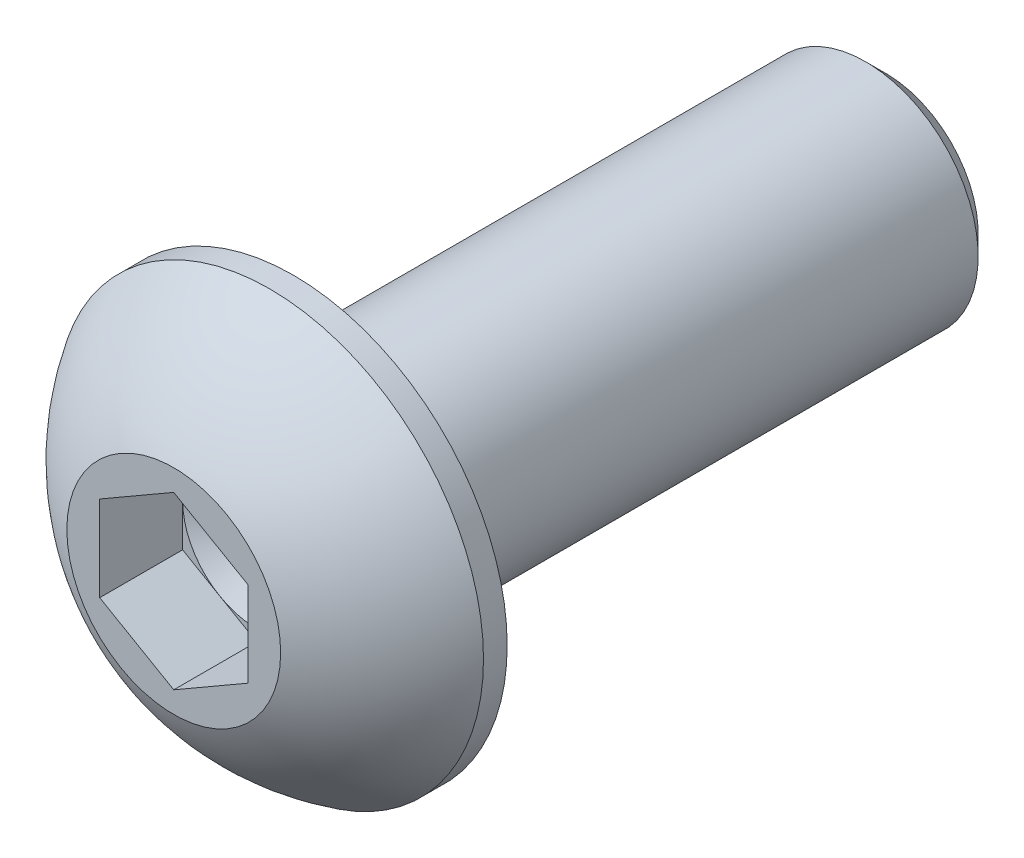
ISO-10303-21;
HEADER;
FILE_DESCRIPTION(('STEP AP214'),'2;1');
FILE_NAME('part.step','',(''),(''),'','','');
FILE_SCHEMA(('AUTOMOTIVE_DESIGN { 1 0 10303 214 1 1 1 1 }'));
ENDSEC;
DATA;
#1=APPLICATION_CONTEXT('core data for automotive mechanical design processes');
#2=APPLICATION_PROTOCOL_DEFINITION('international standard','automotive_design',2000,#1);
#3=PRODUCT_CONTEXT('',#1,'mechanical');
#4=PRODUCT('Part','Part','',(#3));
#5=PRODUCT_RELATED_PRODUCT_CATEGORY('part','',(#4));
#6=PRODUCT_DEFINITION_FORMATION('','',#4);
#7=PRODUCT_DEFINITION_CONTEXT('part definition',#1,'design');
#8=PRODUCT_DEFINITION('design','',#6,#7);
#9=PRODUCT_DEFINITION_SHAPE('','',#8);
#10=(LENGTH_UNIT() NAMED_UNIT(*) SI_UNIT(.MILLI.,.METRE.));
#11=(NAMED_UNIT(*) PLANE_ANGLE_UNIT() SI_UNIT($,.RADIAN.));
#12=(NAMED_UNIT(*) SI_UNIT($,.STERADIAN.) SOLID_ANGLE_UNIT());
#13=UNCERTAINTY_MEASURE_WITH_UNIT(LENGTH_MEASURE(1.E-05),#10,'distance_accuracy_value','');
#14=(GEOMETRIC_REPRESENTATION_CONTEXT(3) GLOBAL_UNCERTAINTY_ASSIGNED_CONTEXT((#13)) GLOBAL_UNIT_ASSIGNED_CONTEXT((#10,
#11,#12)) REPRESENTATION_CONTEXT('',''));
#15=CARTESIAN_POINT('',(0.,0.,0.));
#16=DIRECTION('',(0.,0.,1.));
#17=DIRECTION('',(1.,0.,0.));
#18=AXIS2_PLACEMENT_3D('',#15,#16,#17);
#19=CARTESIAN_POINT('',(0.,0.,-1.778));
#20=DIRECTION('',(0.,0.,1.));
#21=DIRECTION('',(1.,0.,0.));
#22=AXIS2_PLACEMENT_3D('',#19,#20,#21);
#23=PLANE('',#22);
#24=CARTESIAN_POINT('',(0.,0.,-1.778));
#25=DIRECTION('',(0.,0.,1.));
#26=DIRECTION('',(1.,0.,0.));
#27=AXIS2_PLACEMENT_3D('',#24,#25,#26);
#28=CIRCLE('',#27,1.5875);
#29=CARTESIAN_POINT('',(1.5875,0.,-1.778));
#30=VERTEX_POINT('',#29);
#31=CARTESIAN_POINT('',(0.79375,1.3748153285078,-1.778));
#32=VERTEX_POINT('',#31);
#33=EDGE_CURVE('E96',#30,#32,#28,.T.);
#34=ORIENTED_EDGE('',*,*,#33,.F.);
#35=DIRECTION('',(0.,-1.,0.));
#36=VECTOR('',#35,1.);
#37=CARTESIAN_POINT('',(1.5875,0.,-1.778));
#38=LINE('',#37,#36);
#39=CARTESIAN_POINT('',(1.5875,0.916543552338531,-1.778));
#40=VERTEX_POINT('',#39);
#41=EDGE_CURVE('E120',#40,#30,#38,.T.);
#42=ORIENTED_EDGE('',*,*,#41,.F.);
#43=DIRECTION('',(0.866025403784438,-0.5,0.));
#44=VECTOR('',#43,1.);
#45=CARTESIAN_POINT('',(0.79375,1.3748153285078,-1.778));
#46=LINE('',#45,#44);
#47=EDGE_CURVE('E118',#32,#40,#46,.T.);
#48=ORIENTED_EDGE('',*,*,#47,.F.);
#49=EDGE_LOOP('',(#34,#42,#48));
#50=FACE_BOUND('',#49,.T.);
#51=ADVANCED_FACE('F17',(#50),#23,.T.);
#52=CARTESIAN_POINT('',(-0.79375,1.37481532850779,-1.778));
#53=VERTEX_POINT('',#52);
#54=EDGE_CURVE('E98',#32,#53,#28,.T.);
#55=ORIENTED_EDGE('',*,*,#54,.F.);
#56=CARTESIAN_POINT('',(0.,1.83308710467706,-1.778));
#57=VERTEX_POINT('',#56);
#58=EDGE_CURVE('E113',#57,#32,#46,.T.);
#59=ORIENTED_EDGE('',*,*,#58,.F.);
#60=DIRECTION('',(0.866025403784437,0.5,0.));
#61=VECTOR('',#60,1.);
#62=CARTESIAN_POINT('',(-0.79375,1.37481532850779,-1.778));
#63=LINE('',#62,#61);
#64=EDGE_CURVE('E114',#53,#57,#63,.T.);
#65=ORIENTED_EDGE('',*,*,#64,.F.);
#66=EDGE_LOOP('',(#55,#59,#65));
#67=FACE_BOUND('',#66,.T.);
#68=ADVANCED_FACE('F111',(#67),#23,.T.);
#69=CARTESIAN_POINT('',(-1.5875,0.,-1.778));
#70=VERTEX_POINT('',#69);
#71=EDGE_CURVE('E117',#53,#70,#28,.T.);
#72=ORIENTED_EDGE('',*,*,#71,.F.);
#73=CARTESIAN_POINT('',(-1.5875,0.916543552338527,-1.778));
#74=VERTEX_POINT('',#73);
#75=EDGE_CURVE('E134',#74,#53,#63,.T.);
#76=ORIENTED_EDGE('',*,*,#75,.F.);
#77=DIRECTION('',(0.,1.,0.));
#78=VECTOR('',#77,1.);
#79=CARTESIAN_POINT('',(-1.5875,0.,-1.778));
#80=LINE('',#79,#78);
#81=EDGE_CURVE('E138',#70,#74,#80,.T.);
#82=ORIENTED_EDGE('',*,*,#81,.F.);
#83=EDGE_LOOP('',(#72,#76,#82));
#84=FACE_BOUND('',#83,.T.);
#85=ADVANCED_FACE('F227',(#84),#23,.T.);
#86=CARTESIAN_POINT('',(-0.79375,-1.3748153285078,-1.778));
#87=VERTEX_POINT('',#86);
#88=EDGE_CURVE('E252',#70,#87,#28,.T.);
#89=ORIENTED_EDGE('',*,*,#88,.F.);
#90=CARTESIAN_POINT('',(-1.5875,-0.916543552338531,-1.778));
#91=VERTEX_POINT('',#90);
#92=EDGE_CURVE('E139',#91,#70,#80,.T.);
#93=ORIENTED_EDGE('',*,*,#92,.F.);
#94=DIRECTION('',(-0.866025403784438,0.5,0.));
#95=VECTOR('',#94,1.);
#96=CARTESIAN_POINT('',(-0.79375,-1.3748153285078,-1.778));
#97=LINE('',#96,#95);
#98=EDGE_CURVE('E143',#87,#91,#97,.T.);
#99=ORIENTED_EDGE('',*,*,#98,.F.);
#100=EDGE_LOOP('',(#89,#93,#99));
#101=FACE_BOUND('',#100,.T.);
#102=ADVANCED_FACE('F239',(#101),#23,.T.);
#103=CARTESIAN_POINT('',(0.79375,-1.37481532850779,-1.778));
#104=VERTEX_POINT('',#103);
#105=EDGE_CURVE('E33',#87,#104,#28,.T.);
#106=ORIENTED_EDGE('',*,*,#105,.F.);
#107=CARTESIAN_POINT('',(0.,-1.83308710467706,-1.778));
#108=VERTEX_POINT('',#107);
#109=EDGE_CURVE('E144',#108,#87,#97,.T.);
#110=ORIENTED_EDGE('',*,*,#109,.F.);
#111=DIRECTION('',(-0.866025403784437,-0.5,0.));
#112=VECTOR('',#111,1.);
#113=CARTESIAN_POINT('',(0.79375,-1.37481532850779,-1.778));
#114=LINE('',#113,#112);
#115=EDGE_CURVE('E148',#104,#108,#114,.T.);
#116=ORIENTED_EDGE('',*,*,#115,.F.);
#117=EDGE_LOOP('',(#106,#110,#116));
#118=FACE_BOUND('',#117,.T.);
#119=ADVANCED_FACE('F232',(#118),#23,.T.);
#120=CARTESIAN_POINT('',(-1.146175,0.,0.));
#121=DIRECTION('',(0.,0.,1.));
#122=DIRECTION('',(1.,0.,0.));
#123=AXIS2_PLACEMENT_3D('',#120,#121,#122);
#124=PLANE('',#123);
#125=CARTESIAN_POINT('',(0.,0.,0.));
#126=DIRECTION('',(0.,0.,-1.));
#127=DIRECTION('',(-1.,0.,0.));
#128=AXIS2_PLACEMENT_3D('',#125,#126,#127);
#129=CIRCLE('',#128,2.29235);
#130=CARTESIAN_POINT('',(-2.29235000000001,0.,0.));
#131=VERTEX_POINT('',#130);
#132=EDGE_CURVE('E196',#131,#131,#129,.T.);
#133=ORIENTED_EDGE('',*,*,#132,.F.);
#134=EDGE_LOOP('',(#133));
#135=FACE_BOUND('',#134,.T.);
#136=DIRECTION('',(0.866025403784437,0.5,0.));
#137=VECTOR('',#136,1.);
#138=CARTESIAN_POINT('',(-0.79375,1.37481532850779,0.));
#139=LINE('',#138,#137);
#140=CARTESIAN_POINT('',(-1.5875,0.916543552338527,0.));
#141=VERTEX_POINT('',#140);
#142=CARTESIAN_POINT('',(0.,1.83308710467706,0.));
#143=VERTEX_POINT('',#142);
#144=EDGE_CURVE('E159',#141,#143,#139,.T.);
#145=ORIENTED_EDGE('',*,*,#144,.T.);
#146=DIRECTION('',(0.866025403784438,-0.5,0.));
#147=VECTOR('',#146,1.);
#148=CARTESIAN_POINT('',(0.79375,1.3748153285078,0.));
#149=LINE('',#148,#147);
#150=CARTESIAN_POINT('',(1.5875,0.916543552338531,0.));
#151=VERTEX_POINT('',#150);
#152=EDGE_CURVE('E106',#143,#151,#149,.T.);
#153=ORIENTED_EDGE('',*,*,#152,.T.);
#154=DIRECTION('',(0.,-1.,0.));
#155=VECTOR('',#154,1.);
#156=CARTESIAN_POINT('',(1.5875,0.,0.));
#157=LINE('',#156,#155);
#158=CARTESIAN_POINT('',(1.5875,-0.916543552338531,0.));
#159=VERTEX_POINT('',#158);
#160=EDGE_CURVE('E124',#151,#159,#157,.T.);
#161=ORIENTED_EDGE('',*,*,#160,.T.);
#162=DIRECTION('',(-0.866025403784437,-0.5,0.));
#163=VECTOR('',#162,1.);
#164=CARTESIAN_POINT('',(0.79375,-1.37481532850779,0.));
#165=LINE('',#164,#163);
#166=CARTESIAN_POINT('',(0.,-1.83308710467706,0.));
#167=VERTEX_POINT('',#166);
#168=EDGE_CURVE('E41',#159,#167,#165,.T.);
#169=ORIENTED_EDGE('',*,*,#168,.T.);
#170=DIRECTION('',(-0.866025403784438,0.5,0.));
#171=VECTOR('',#170,1.);
#172=CARTESIAN_POINT('',(-0.79375,-1.3748153285078,0.));
#173=LINE('',#172,#171);
#174=CARTESIAN_POINT('',(-1.5875,-0.916543552338531,0.));
#175=VERTEX_POINT('',#174);
#176=EDGE_CURVE('E167',#167,#175,#173,.T.);
#177=ORIENTED_EDGE('',*,*,#176,.T.);
#178=DIRECTION('',(0.,1.,0.));
#179=VECTOR('',#178,1.);
#180=CARTESIAN_POINT('',(-1.5875,0.,0.));
#181=LINE('',#180,#179);
#182=EDGE_CURVE('E163',#175,#141,#181,.T.);
#183=ORIENTED_EDGE('',*,*,#182,.T.);
#184=EDGE_LOOP('',(#145,#153,#161,#169,#177,#183));
#185=FACE_BOUND('',#184,.T.);
#186=ADVANCED_FACE('F238',(#135,#185),#124,.T.);
#187=CARTESIAN_POINT('',(0.,0.,1.48381805047393));
#188=DIRECTION('',(0.,0.,-1.));
#189=DIRECTION('',(-1.,0.,0.));
#190=AXIS2_PLACEMENT_3D('',#187,#188,#189);
#191=CYLINDRICAL_SURFACE('',#190,4.5847);
#192=CARTESIAN_POINT('',(0.,0.,-2.0574));
#193=DIRECTION('',(0.,0.,-1.));
#194=DIRECTION('',(-1.,0.,0.));
#195=AXIS2_PLACEMENT_3D('',#192,#193,#194);
#196=CIRCLE('',#195,4.5847);
#197=CARTESIAN_POINT('',(-4.5847,0.,-2.0574));
#198=VERTEX_POINT('',#197);
#199=EDGE_CURVE('E192',#198,#198,#196,.T.);
#200=ORIENTED_EDGE('',*,*,#199,.T.);
#201=EDGE_LOOP('',(#200));
#202=FACE_BOUND('',#201,.T.);
#203=CARTESIAN_POINT('',(0.,0.,-2.5654));
#204=DIRECTION('',(0.,0.,-1.));
#205=DIRECTION('',(-1.,0.,0.));
#206=AXIS2_PLACEMENT_3D('',#203,#204,#205);
#207=CIRCLE('',#206,4.5847);
#208=CARTESIAN_POINT('',(-4.5847,0.,-2.5654));
#209=VERTEX_POINT('',#208);
#210=EDGE_CURVE('E208',#209,#209,#207,.T.);
#211=ORIENTED_EDGE('',*,*,#210,.F.);
#212=EDGE_LOOP('',(#211));
#213=FACE_BOUND('',#212,.T.);
#214=ADVANCED_FACE('F244',(#202,#213),#191,.T.);
#215=CARTESIAN_POINT('',(-3.68935,0.,-2.5654));
#216=DIRECTION('',(0.,0.,-1.));
#217=DIRECTION('',(-1.,0.,0.));
#218=AXIS2_PLACEMENT_3D('',#215,#216,#217);
#219=PLANE('',#218);
#220=ORIENTED_EDGE('',*,*,#210,.T.);
#221=EDGE_LOOP('',(#220));
#222=FACE_BOUND('',#221,.T.);
#223=CARTESIAN_POINT('',(0.,0.,-2.5654));
#224=DIRECTION('',(0.,0.,-1.));
#225=DIRECTION('',(-1.,0.,0.));
#226=AXIS2_PLACEMENT_3D('',#223,#224,#225);
#227=CIRCLE('',#226,2.794);
#228=CARTESIAN_POINT('',(-2.794,0.,-2.5654));
#229=VERTEX_POINT('',#228);
#230=EDGE_CURVE('E204',#229,#229,#227,.T.);
#231=ORIENTED_EDGE('',*,*,#230,.F.);
#232=EDGE_LOOP('',(#231));
#233=FACE_BOUND('',#232,.T.);
#234=ADVANCED_FACE('F311',(#222,#233),#219,.T.);
#235=CARTESIAN_POINT('',(0.,0.,-2.9464));
#236=DIRECTION('',(0.,0.,-1.));
#237=DIRECTION('',(-1.,0.,0.));
#238=AXIS2_PLACEMENT_3D('',#235,#236,#237);
#239=TOROIDAL_SURFACE('',#238,2.794,0.381);
#240=ORIENTED_EDGE('',*,*,#230,.T.);
#241=EDGE_LOOP('',(#240));
#242=FACE_BOUND('',#241,.T.);
#243=CARTESIAN_POINT('',(0.,0.,-2.9464));
#244=DIRECTION('',(0.,0.,-1.));
#245=DIRECTION('',(-1.,0.,0.));
#246=AXIS2_PLACEMENT_3D('',#243,#244,#245);
#247=CIRCLE('',#246,2.413);
#248=CARTESIAN_POINT('',(-2.413,0.,-2.9464));
#249=VERTEX_POINT('',#248);
#250=EDGE_CURVE('E200',#249,#249,#247,.T.);
#251=ORIENTED_EDGE('',*,*,#250,.F.);
#252=EDGE_LOOP('',(#251));
#253=FACE_BOUND('',#252,.T.);
#254=ADVANCED_FACE('F319',(#242,#253),#239,.F.);
#255=CARTESIAN_POINT('',(0.,0.,1.48381805047393));
#256=DIRECTION('',(0.,0.,-1.));
#257=DIRECTION('',(-1.,0.,0.));
#258=AXIS2_PLACEMENT_3D('',#255,#256,#257);
#259=CYLINDRICAL_SURFACE('',#258,2.413);
#260=CARTESIAN_POINT('',(0.,0.,-14.83645761938));
#261=DIRECTION('',(0.,0.,-1.));
#262=DIRECTION('',(-1.,0.,0.));
#263=AXIS2_PLACEMENT_3D('',#260,#261,#262);
#264=CIRCLE('',#263,2.413);
#265=CARTESIAN_POINT('',(-2.413,0.,-14.83645761938));
#266=VERTEX_POINT('',#265);
#267=EDGE_CURVE('E11',#266,#266,#264,.F.);
#268=ORIENTED_EDGE('',*,*,#267,.T.);
#269=EDGE_LOOP('',(#268));
#270=FACE_BOUND('',#269,.T.);
#271=ORIENTED_EDGE('',*,*,#250,.T.);
#272=EDGE_LOOP('',(#271));
#273=FACE_BOUND('',#272,.T.);
#274=ADVANCED_FACE('F328',(#270,#273),#259,.T.);
#275=CARTESIAN_POINT('',(-1.2065,0.,-15.2654));
#276=DIRECTION('',(0.,0.,-1.));
#277=DIRECTION('',(-1.,0.,0.));
#278=AXIS2_PLACEMENT_3D('',#275,#276,#277);
#279=PLANE('',#278);
#280=CARTESIAN_POINT('',(0.,0.,-15.2654));
#281=DIRECTION('',(0.,0.,-1.));
#282=DIRECTION('',(-1.,0.,0.));
#283=AXIS2_PLACEMENT_3D('',#280,#281,#282);
#284=CIRCLE('',#283,1.98405761938);
#285=CARTESIAN_POINT('',(-1.98405761938,0.,-15.2654));
#286=VERTEX_POINT('',#285);
#287=EDGE_CURVE('E26',#286,#286,#284,.T.);
#288=ORIENTED_EDGE('',*,*,#287,.T.);
#289=EDGE_LOOP('',(#288));
#290=FACE_BOUND('',#289,.T.);
#291=ADVANCED_FACE('F216',(#290),#279,.T.);
#292=CARTESIAN_POINT('',(0.,0.,-4.85989606481481));
#293=DIRECTION('',(0.,0.,-1.));
#294=DIRECTION('',(-1.,0.,0.));
#295=AXIS2_PLACEMENT_3D('',#292,#293,#294);
#296=SPHERICAL_SURFACE('',#295,5.37340285883187);
#297=CARTESIAN_POINT('',(-4.5847,0.,-2.0574));
#298=CARTESIAN_POINT('',(-4.56772775071365,0.,-2.02963444466225));
#299=CARTESIAN_POINT('',(-4.55050321576171,0.,-2.00202310563314));
#300=CARTESIAN_POINT('',(-4.51555538986232,0.,-1.94711789153313));
#301=CARTESIAN_POINT('',(-4.49783209891487,0.,-1.91982401646224));
#302=CARTESIAN_POINT('',(-4.4618925763601,0.,-1.8655627616196));
#303=CARTESIAN_POINT('',(-4.44367634475278,0.,-1.83859538184787));
#304=CARTESIAN_POINT('',(-4.40675696303686,0.,-1.78499601309644));
#305=CARTESIAN_POINT('',(-4.38805381292827,0.,-1.75836402411674));
#306=CARTESIAN_POINT('',(-4.35016676527117,0.,-1.70544422925954));
#307=CARTESIAN_POINT('',(-4.33098286772266,0.,-1.67915642338203));
#308=CARTESIAN_POINT('',(-4.29214065809995,0.,-1.62693367141508));
#309=CARTESIAN_POINT('',(-4.27248234602574,0.,-1.60099872532564));
#310=CARTESIAN_POINT('',(-4.23269779601254,0.,-1.54949025368841));
#311=CARTESIAN_POINT('',(-4.21257155807355,0.,-1.52391672814064));
#312=CARTESIAN_POINT('',(-4.17185779967265,0.,-1.4731395388975));
#313=CARTESIAN_POINT('',(-4.15127027921075,0.,-1.44793587520214));
#314=CARTESIAN_POINT('',(-4.10964075130566,0.,-1.39790672892889));
#315=CARTESIAN_POINT('',(-4.08859874386249,0.,-1.37308124635099));
#316=CARTESIAN_POINT('',(-4.04606718757048,0.,-1.32381665673685));
#317=CARTESIAN_POINT('',(-4.02457763872164,0.,-1.29937754970059));
#318=CARTESIAN_POINT('',(-3.98115809291457,0.,-1.25089377806135));
#319=CARTESIAN_POINT('',(-3.95922809595633,0.,-1.22684911345837));
#320=CARTESIAN_POINT('',(-3.91493489261154,0.,-1.1791621633785));
#321=CARTESIAN_POINT('',(-3.892571686225,0.,-1.15551987790161));
#322=CARTESIAN_POINT('',(-3.84741944569869,0.,-1.10864548994917));
#323=CARTESIAN_POINT('',(-3.82463041155893,0.,-1.08541338747362));
#324=CARTESIAN_POINT('',(-3.77863403775912,0.,-1.03936703400529));
#325=CARTESIAN_POINT('',(-3.75542669809908,0.,-1.01655278301252));
#326=CARTESIAN_POINT('',(-3.70860137356642,0.,-0.971349663066289));
#327=CARTESIAN_POINT('',(-3.68498338869382,0.,-0.94896079411283));
#328=CARTESIAN_POINT('',(-3.63734456959005,0.,-0.904615828391113));
#329=CARTESIAN_POINT('',(-3.61332373535889,0.,-0.882659731622856));
#330=CARTESIAN_POINT('',(-3.56488714636506,0.,-0.839187557567447));
#331=CARTESIAN_POINT('',(-3.54047139160238,0.,-0.817671480280295));
#332=CARTESIAN_POINT('',(-3.4912530207284,0.,-0.775086447240822));
#333=CARTESIAN_POINT('',(-3.4664504046171,0.,-0.754017491488501));
#334=CARTESIAN_POINT('',(-3.41646649792444,0.,-0.712333655985979));
#335=CARTESIAN_POINT('',(-3.39128520734309,0.,-0.691718776235777));
#336=CARTESIAN_POINT('',(-3.34055226358225,0.,-0.650949897322802));
#337=CARTESIAN_POINT('',(-3.31500061040276,0.,-0.630795898160027));
#338=CARTESIAN_POINT('',(-3.26353537556731,0.,-0.590955432879197));
#339=CARTESIAN_POINT('',(-3.23762179391134,0.,-0.57126896676114));
#340=CARTESIAN_POINT('',(-3.18544125571044,0.,-0.532370065703055));
#341=CARTESIAN_POINT('',(-3.15917429916551,0.,-0.513157630763025));
#342=CARTESIAN_POINT('',(-3.10629568141643,0.,-0.475213133725829));
#343=CARTESIAN_POINT('',(-3.07968402021229,0.,-0.456481071628663));
#344=CARTESIAN_POINT('',(-3.02612477715573,0.,-0.419503503378719));
#345=CARTESIAN_POINT('',(-2.99917719530331,0.,-0.40125799722594));
#346=CARTESIAN_POINT('',(-2.94495500583993,0.,-0.365259563367945));
#347=CARTESIAN_POINT('',(-2.91768039822897,0.,-0.347506635662729));
#348=CARTESIAN_POINT('',(-2.8628131600919,0.,-0.312499218594777));
#349=CARTESIAN_POINT('',(-2.83522052956579,0.,-0.295244729232041));
#350=CARTESIAN_POINT('',(-2.77972635338319,0.,-0.261239884283562));
#351=CARTESIAN_POINT('',(-2.75182480772671,0.,-0.244489528697819));
#352=CARTESIAN_POINT('',(-2.69572201115466,0.,-0.211498480091079));
#353=CARTESIAN_POINT('',(-2.6675207602391,0.,-0.195257787070081));
#354=CARTESIAN_POINT('',(-2.61082786150165,0.,-0.163291425052401));
#355=CARTESIAN_POINT('',(-2.58233621367977,0.,-0.147565756055718));
#356=CARTESIAN_POINT('',(-2.52507192700006,0.,-0.116634630180611));
#357=CARTESIAN_POINT('',(-2.49629928814224,0.,-0.101429173302187));
#358=CARTESIAN_POINT('',(-2.43848251180434,0.,-0.0715435006068001));
#359=CARTESIAN_POINT('',(-2.40943837432427,0.,-0.0568632847898376));
#360=CARTESIAN_POINT('',(-2.35108820593536,0.,-0.0280329029080984));
#361=CARTESIAN_POINT('',(-2.32178217502651,0.,-0.0138827368433216));
#362=CARTESIAN_POINT('',(-2.29235000000001,0.,0.));
#363=B_SPLINE_CURVE_WITH_KNOTS('',3,(#297,#298,#299,#300,#301,#302,#303,#304,#305,#306,#307,
#308,#309,#310,#311,#312,#313,#314,#315,#316,#317,#318,#319,#320,#321,#322,#323,#324,#325,#326,
#327,#328,#329,#330,#331,#332,#333,#334,#335,#336,#337,#338,#339,#340,#341,#342,#343,#344,#345,
#346,#347,#348,#349,#350,#351,#352,#353,#354,#355,#356,#357,#358,#359,#360,#361,#362),
.UNSPECIFIED.,.F.,.F.,(4,2,2,2,2,2,2,2,2,2,2,2,2,2,2,2,2,2,2,2,2,2,2,2,2,2,2,2,2,2,2,2,4),(0.,
0.09762472664678,0.195249453293559,0.292874179940339,0.390498906587117,0.488123633233897,
0.585748359880676,0.683373086527455,0.780997813174235,0.878622539821013,0.976247266467793,
1.07387199311457,1.17149671976135,1.26912144640813,1.36674617305491,1.46437089970169,
1.56199562634847,1.65962035299525,1.75724507964203,1.85486980628881,1.95249453293559,
2.05011925958237,2.14774398622914,2.24536871287592,2.3429934395227,2.44061816616948,
2.53824289281626,2.63586761946304,2.73349234610982,2.8311170727566,2.92874179940338,
3.02636652605016,3.12399125269694),.UNSPECIFIED.);
#364=EDGE_CURVE('BSEAM345',#198,#131,#363,.T.);
#365=ORIENTED_EDGE('',*,*,#199,.F.);
#366=ORIENTED_EDGE('',*,*,#132,.T.);
#367=ORIENTED_EDGE('',*,*,#364,.T.);
#368=ORIENTED_EDGE('',*,*,#364,.F.);
#369=EDGE_LOOP('',(#365,#367,#366,#368));
#370=FACE_BOUND('',#369,.T.);
#371=ADVANCED_FACE('F345',(#370),#296,.T.);
#372=CARTESIAN_POINT('',(0.79375,1.3748153285078,-1.778));
#373=DIRECTION('',(-0.5,-0.866025403784438,0.));
#374=DIRECTION('',(0.866025403784438,-0.5,0.));
#375=AXIS2_PLACEMENT_3D('',#372,#373,#374);
#376=PLANE('',#375);
#377=ORIENTED_EDGE('',*,*,#152,.F.);
#378=DIRECTION('',(0.,0.,1.));
#379=VECTOR('',#378,1.);
#380=CARTESIAN_POINT('',(0.,1.83308710467706,-1.778));
#381=LINE('',#380,#379);
#382=EDGE_CURVE('E129',#57,#143,#381,.T.);
#383=ORIENTED_EDGE('',*,*,#382,.F.);
#384=ORIENTED_EDGE('',*,*,#58,.T.);
#385=ORIENTED_EDGE('',*,*,#47,.T.);
#386=DIRECTION('',(0.,0.,1.));
#387=VECTOR('',#386,1.);
#388=CARTESIAN_POINT('',(1.5875,0.916543552338531,-1.778));
#389=LINE('',#388,#387);
#390=EDGE_CURVE('E155',#40,#151,#389,.T.);
#391=ORIENTED_EDGE('',*,*,#390,.T.);
#392=EDGE_LOOP('',(#377,#383,#384,#385,#391));
#393=FACE_BOUND('',#392,.T.);
#394=ADVANCED_FACE('F128',(#393),#376,.T.);
#395=CARTESIAN_POINT('',(-0.79375,1.37481532850779,-1.778));
#396=DIRECTION('',(0.5,-0.866025403784437,0.));
#397=DIRECTION('',(0.866025403784437,0.5,0.));
#398=AXIS2_PLACEMENT_3D('',#395,#396,#397);
#399=PLANE('',#398);
#400=ORIENTED_EDGE('',*,*,#144,.F.);
#401=DIRECTION('',(0.,0.,1.));
#402=VECTOR('',#401,1.);
#403=CARTESIAN_POINT('',(-1.5875,0.916543552338527,-1.778));
#404=LINE('',#403,#402);
#405=EDGE_CURVE('E187',#74,#141,#404,.T.);
#406=ORIENTED_EDGE('',*,*,#405,.F.);
#407=ORIENTED_EDGE('',*,*,#75,.T.);
#408=ORIENTED_EDGE('',*,*,#64,.T.);
#409=ORIENTED_EDGE('',*,*,#382,.T.);
#410=EDGE_LOOP('',(#400,#406,#407,#408,#409));
#411=FACE_BOUND('',#410,.T.);
#412=ADVANCED_FACE('F274',(#411),#399,.T.);
#413=CARTESIAN_POINT('',(-1.5875,0.,-1.778));
#414=DIRECTION('',(1.,0.,0.));
#415=DIRECTION('',(0.,0.,-1.));
#416=AXIS2_PLACEMENT_3D('',#413,#414,#415);
#417=PLANE('',#416);
#418=ORIENTED_EDGE('',*,*,#182,.F.);
#419=DIRECTION('',(0.,0.,1.));
#420=VECTOR('',#419,1.);
#421=CARTESIAN_POINT('',(-1.5875,-0.916543552338531,-1.778));
#422=LINE('',#421,#420);
#423=EDGE_CURVE('E184',#91,#175,#422,.T.);
#424=ORIENTED_EDGE('',*,*,#423,.F.);
#425=ORIENTED_EDGE('',*,*,#92,.T.);
#426=ORIENTED_EDGE('',*,*,#81,.T.);
#427=ORIENTED_EDGE('',*,*,#405,.T.);
#428=EDGE_LOOP('',(#418,#424,#425,#426,#427));
#429=FACE_BOUND('',#428,.T.);
#430=ADVANCED_FACE('F269',(#429),#417,.T.);
#431=CARTESIAN_POINT('',(-0.79375,-1.3748153285078,-1.778));
#432=DIRECTION('',(0.5,0.866025403784438,0.));
#433=DIRECTION('',(-0.866025403784438,0.5,0.));
#434=AXIS2_PLACEMENT_3D('',#431,#432,#433);
#435=PLANE('',#434);
#436=ORIENTED_EDGE('',*,*,#176,.F.);
#437=DIRECTION('',(0.,0.,1.));
#438=VECTOR('',#437,1.);
#439=CARTESIAN_POINT('',(0.,-1.83308710467706,-1.778));
#440=LINE('',#439,#438);
#441=EDGE_CURVE('E181',#108,#167,#440,.T.);
#442=ORIENTED_EDGE('',*,*,#441,.F.);
#443=ORIENTED_EDGE('',*,*,#109,.T.);
#444=ORIENTED_EDGE('',*,*,#98,.T.);
#445=ORIENTED_EDGE('',*,*,#423,.T.);
#446=EDGE_LOOP('',(#436,#442,#443,#444,#445));
#447=FACE_BOUND('',#446,.T.);
#448=ADVANCED_FACE('F260',(#447),#435,.T.);
#449=CARTESIAN_POINT('',(0.79375,-1.37481532850779,-1.778));
#450=DIRECTION('',(-0.5,0.866025403784437,0.));
#451=DIRECTION('',(-0.866025403784437,-0.5,0.));
#452=AXIS2_PLACEMENT_3D('',#449,#450,#451);
#453=PLANE('',#452);
#454=ORIENTED_EDGE('',*,*,#168,.F.);
#455=DIRECTION('',(0.,0.,1.));
#456=VECTOR('',#455,1.);
#457=CARTESIAN_POINT('',(1.5875,-0.916543552338531,-1.778));
#458=LINE('',#457,#456);
#459=CARTESIAN_POINT('',(1.5875,-0.916543552338531,-1.778));
#460=VERTEX_POINT('',#459);
#461=EDGE_CURVE('E178',#460,#159,#458,.T.);
#462=ORIENTED_EDGE('',*,*,#461,.F.);
#463=EDGE_CURVE('E149',#460,#104,#114,.T.);
#464=ORIENTED_EDGE('',*,*,#463,.T.);
#465=ORIENTED_EDGE('',*,*,#115,.T.);
#466=ORIENTED_EDGE('',*,*,#441,.T.);
#467=EDGE_LOOP('',(#454,#462,#464,#465,#466));
#468=FACE_BOUND('',#467,.T.);
#469=ADVANCED_FACE('F235',(#468),#453,.T.);
#470=CARTESIAN_POINT('',(1.5875,0.,-1.778));
#471=DIRECTION('',(-1.,0.,0.));
#472=DIRECTION('',(0.,0.,1.));
#473=AXIS2_PLACEMENT_3D('',#470,#471,#472);
#474=PLANE('',#473);
#475=ORIENTED_EDGE('',*,*,#160,.F.);
#476=ORIENTED_EDGE('',*,*,#390,.F.);
#477=ORIENTED_EDGE('',*,*,#41,.T.);
#478=EDGE_CURVE('E152',#30,#460,#38,.T.);
#479=ORIENTED_EDGE('',*,*,#478,.T.);
#480=ORIENTED_EDGE('',*,*,#461,.T.);
#481=EDGE_LOOP('',(#475,#476,#477,#479,#480));
#482=FACE_BOUND('',#481,.T.);
#483=ADVANCED_FACE('F230',(#482),#474,.T.);
#484=EDGE_CURVE('E100',#104,#30,#28,.T.);
#485=ORIENTED_EDGE('',*,*,#484,.F.);
#486=ORIENTED_EDGE('',*,*,#463,.F.);
#487=ORIENTED_EDGE('',*,*,#478,.F.);
#488=EDGE_LOOP('',(#485,#486,#487));
#489=FACE_BOUND('',#488,.T.);
#490=ADVANCED_FACE('F93',(#489),#23,.T.);
#491=CARTESIAN_POINT('',(0.,0.,-1.778));
#492=DIRECTION('',(0.,0.,1.));
#493=DIRECTION('',(1.,0.,0.));
#494=AXIS2_PLACEMENT_3D('',#491,#492,#493);
#495=CONICAL_SURFACE('',#494,1.5875,1.0471975511966);
#496=CARTESIAN_POINT('',(0.,0.,-2.69454355233854));
#497=VERTEX_POINT('',#496);
#498=VERTEX_LOOP('',#497);
#499=FACE_BOUND('',#498,.T.);
#500=ORIENTED_EDGE('',*,*,#33,.T.);
#501=ORIENTED_EDGE('',*,*,#54,.T.);
#502=ORIENTED_EDGE('',*,*,#71,.T.);
#503=ORIENTED_EDGE('',*,*,#88,.T.);
#504=ORIENTED_EDGE('',*,*,#105,.T.);
#505=ORIENTED_EDGE('',*,*,#484,.T.);
#506=EDGE_LOOP('',(#500,#501,#502,#503,#504,#505));
#507=FACE_BOUND('',#506,.T.);
#508=ADVANCED_FACE('F91',(#499,#507),#495,.F.);
#509=CARTESIAN_POINT('',(0.,0.,-15.2654));
#510=DIRECTION('',(0.,0.,1.));
#511=DIRECTION('',(1.,0.,0.));
#512=AXIS2_PLACEMENT_3D('',#509,#510,#511);
#513=CONICAL_SURFACE('',#512,1.98405761938,0.785398163397449);
#514=ORIENTED_EDGE('',*,*,#267,.F.);
#515=EDGE_LOOP('',(#514));
#516=FACE_BOUND('',#515,.T.);
#517=ORIENTED_EDGE('',*,*,#287,.F.);
#518=EDGE_LOOP('',(#517));
#519=FACE_BOUND('',#518,.T.);
#520=ADVANCED_FACE('F19',(#516,#519),#513,.T.);
#521=CLOSED_SHELL('',(#51,#68,#85,#102,#119,#186,#214,#234,#254,#274,#291,#371,#394,#412,#430,
#448,#469,#483,#490,#508,#520));
#522=MANIFOLD_SOLID_BREP('B1',#521);
#523=ADVANCED_BREP_SHAPE_REPRESENTATION('',(#18,#522),#14);
#524=SHAPE_DEFINITION_REPRESENTATION(#9,#523);
ENDSEC;
END-ISO-10303-21;
